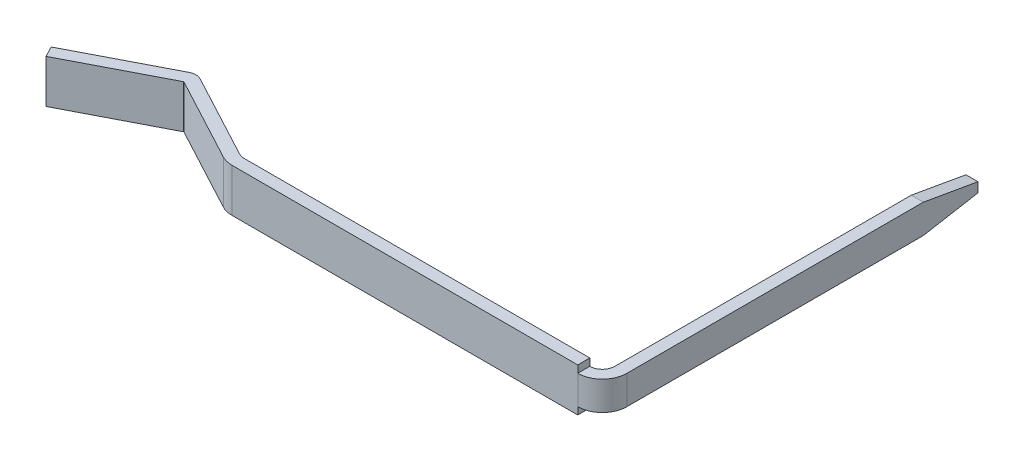
ISO-10303-21;
HEADER;
FILE_DESCRIPTION(('STEP AP214'),'2;1');
FILE_NAME('part.step','',(''),(''),'','','');
FILE_SCHEMA(('AUTOMOTIVE_DESIGN { 1 0 10303 214 1 1 1 1 }'));
ENDSEC;
DATA;
#1=APPLICATION_CONTEXT('core data for automotive mechanical design processes');
#2=APPLICATION_PROTOCOL_DEFINITION('international standard','automotive_design',2000,#1);
#3=PRODUCT_CONTEXT('',#1,'mechanical');
#4=PRODUCT('Part','Part','',(#3));
#5=PRODUCT_RELATED_PRODUCT_CATEGORY('part','',(#4));
#6=PRODUCT_DEFINITION_FORMATION('','',#4);
#7=PRODUCT_DEFINITION_CONTEXT('part definition',#1,'design');
#8=PRODUCT_DEFINITION('design','',#6,#7);
#9=PRODUCT_DEFINITION_SHAPE('','',#8);
#10=(LENGTH_UNIT() NAMED_UNIT(*) SI_UNIT(.MILLI.,.METRE.));
#11=(NAMED_UNIT(*) PLANE_ANGLE_UNIT() SI_UNIT($,.RADIAN.));
#12=(NAMED_UNIT(*) SI_UNIT($,.STERADIAN.) SOLID_ANGLE_UNIT());
#13=UNCERTAINTY_MEASURE_WITH_UNIT(LENGTH_MEASURE(1.E-05),#10,'distance_accuracy_value','');
#14=(GEOMETRIC_REPRESENTATION_CONTEXT(3) GLOBAL_UNCERTAINTY_ASSIGNED_CONTEXT((#13)) GLOBAL_UNIT_ASSIGNED_CONTEXT((#10,
#11,#12)) REPRESENTATION_CONTEXT('',''));
#15=CARTESIAN_POINT('',(0.,0.,0.));
#16=DIRECTION('',(0.,0.,1.));
#17=DIRECTION('',(1.,0.,0.));
#18=AXIS2_PLACEMENT_3D('',#15,#16,#17);
#19=CARTESIAN_POINT('',(3.845,-0.1,-3.64));
#20=DIRECTION('',(0.,0.,-1.));
#21=DIRECTION('',(0.,1.,0.));
#22=AXIS2_PLACEMENT_3D('',#19,#20,#21);
#23=PLANE('',#22);
#24=DIRECTION('',(0.,-1.,0.));
#25=VECTOR('',#24,1.);
#26=CARTESIAN_POINT('',(3.845,0.,-3.64));
#27=LINE('',#26,#25);
#28=CARTESIAN_POINT('',(3.845,0.100000000000001,-3.64));
#29=VERTEX_POINT('',#28);
#30=CARTESIAN_POINT('',(3.845,-0.100000000000001,-3.64));
#31=VERTEX_POINT('',#30);
#32=EDGE_CURVE('E142',#29,#31,#27,.T.);
#33=ORIENTED_EDGE('',*,*,#32,.F.);
#34=DIRECTION('',(-1.,0.,0.));
#35=VECTOR('',#34,1.);
#36=CARTESIAN_POINT('',(3.97,0.1,-3.64));
#37=LINE('',#36,#35);
#38=CARTESIAN_POINT('',(4.095,0.100000000000001,-3.64));
#39=VERTEX_POINT('',#38);
#40=EDGE_CURVE('E133',#39,#29,#37,.T.);
#41=ORIENTED_EDGE('',*,*,#40,.F.);
#42=DIRECTION('',(0.,1.,0.));
#43=VECTOR('',#42,1.);
#44=CARTESIAN_POINT('',(4.095,0.,-3.64));
#45=LINE('',#44,#43);
#46=CARTESIAN_POINT('',(4.095,-0.100000000000001,-3.64));
#47=VERTEX_POINT('',#46);
#48=EDGE_CURVE('E130',#47,#39,#45,.T.);
#49=ORIENTED_EDGE('',*,*,#48,.F.);
#50=DIRECTION('',(1.,0.,0.));
#51=VECTOR('',#50,1.);
#52=CARTESIAN_POINT('',(3.97,-0.1,-3.64));
#53=LINE('',#52,#51);
#54=EDGE_CURVE('E154',#31,#47,#53,.T.);
#55=ORIENTED_EDGE('',*,*,#54,.F.);
#56=EDGE_LOOP('',(#33,#41,#49,#55));
#57=FACE_BOUND('',#56,.T.);
#58=ADVANCED_FACE('F15',(#57),#23,.T.);
#59=CARTESIAN_POINT('',(4.095,-0.3,-2.50574363607644));
#60=DIRECTION('',(0.,-0.984807753012209,-0.173648177666928));
#61=DIRECTION('',(-1.,0.,0.));
#62=AXIS2_PLACEMENT_3D('',#59,#60,#61);
#63=PLANE('',#62);
#64=DIRECTION('',(0.,0.173648177666932,-0.984807753012208));
#65=VECTOR('',#64,1.);
#66=CARTESIAN_POINT('',(4.095,-0.3,-2.50574363607648));
#67=LINE('',#66,#65);
#68=CARTESIAN_POINT('',(4.095,-0.3,-2.50574363607648));
#69=VERTEX_POINT('',#68);
#70=EDGE_CURVE('E121',#69,#47,#67,.T.);
#71=ORIENTED_EDGE('',*,*,#70,.F.);
#72=DIRECTION('',(1.,0.,0.));
#73=VECTOR('',#72,1.);
#74=CARTESIAN_POINT('',(3.84,-0.3,-2.50574363607648));
#75=LINE('',#74,#73);
#76=CARTESIAN_POINT('',(3.845,-0.3,-2.50574363607644));
#77=VERTEX_POINT('',#76);
#78=EDGE_CURVE('E113',#77,#69,#75,.T.);
#79=ORIENTED_EDGE('',*,*,#78,.F.);
#80=DIRECTION('',(0.,-0.173648177666921,0.98480775301221));
#81=VECTOR('',#80,1.);
#82=CARTESIAN_POINT('',(3.845,-0.100000000000002,-3.64));
#83=LINE('',#82,#81);
#84=EDGE_CURVE('E147',#31,#77,#83,.T.);
#85=ORIENTED_EDGE('',*,*,#84,.F.);
#86=ORIENTED_EDGE('',*,*,#54,.T.);
#87=EDGE_LOOP('',(#71,#79,#85,#86));
#88=FACE_BOUND('',#87,.T.);
#89=ADVANCED_FACE('F234',(#88),#63,.T.);
#90=CARTESIAN_POINT('',(3.585,-0.3,4.18993446181646));
#91=DIRECTION('',(0.,-1.,0.));
#92=DIRECTION('',(0.,0.,-1.));
#93=AXIS2_PLACEMENT_3D('',#90,#91,#92);
#94=PLANE('',#93);
#95=DIRECTION('',(0.,0.,-1.));
#96=VECTOR('',#95,1.);
#97=CARTESIAN_POINT('',(3.585,-0.3,0.84209541286999));
#98=LINE('',#97,#96);
#99=CARTESIAN_POINT('',(3.585,-0.299999999999998,4.15));
#100=VERTEX_POINT('',#99);
#101=CARTESIAN_POINT('',(3.585,-0.299999999999999,3.9));
#102=VERTEX_POINT('',#101);
#103=EDGE_CURVE('E112',#100,#102,#98,.T.);
#104=ORIENTED_EDGE('',*,*,#103,.T.);
#105=CARTESIAN_POINT('',(3.585,-0.3,3.64));
#106=DIRECTION('',(0.,-1.,0.));
#107=DIRECTION('',(1.,0.,0.));
#108=AXIS2_PLACEMENT_3D('',#105,#106,#107);
#109=CIRCLE('',#108,0.26);
#110=CARTESIAN_POINT('',(3.845,-0.3,3.64));
#111=VERTEX_POINT('',#110);
#112=EDGE_CURVE('E122',#102,#111,#109,.F.);
#113=ORIENTED_EDGE('',*,*,#112,.T.);
#114=DIRECTION('',(0.,0.,1.));
#115=VECTOR('',#114,1.);
#116=CARTESIAN_POINT('',(3.845,-0.3,0.));
#117=LINE('',#116,#115);
#118=EDGE_CURVE('E148',#77,#111,#117,.T.);
#119=ORIENTED_EDGE('',*,*,#118,.F.);
#120=ORIENTED_EDGE('',*,*,#78,.T.);
#121=DIRECTION('',(0.,0.,-1.));
#122=VECTOR('',#121,1.);
#123=CARTESIAN_POINT('',(4.095,-0.3,0.));
#124=LINE('',#123,#122);
#125=CARTESIAN_POINT('',(4.095,-0.3,3.64));
#126=VERTEX_POINT('',#125);
#127=EDGE_CURVE('E115',#126,#69,#124,.T.);
#128=ORIENTED_EDGE('',*,*,#127,.F.);
#129=CARTESIAN_POINT('',(3.585,-0.3,3.64));
#130=DIRECTION('',(0.,-1.,0.));
#131=DIRECTION('',(0.,0.,-1.));
#132=AXIS2_PLACEMENT_3D('',#129,#130,#131);
#133=CIRCLE('',#132,0.509999999999999);
#134=EDGE_CURVE('E19',#126,#100,#133,.T.);
#135=ORIENTED_EDGE('',*,*,#134,.T.);
#136=EDGE_LOOP('',(#104,#113,#119,#120,#128,#135));
#137=FACE_BOUND('',#136,.T.);
#138=ADVANCED_FACE('F116',(#137),#94,.T.);
#139=CARTESIAN_POINT('',(4.095,-0.3,3.64));
#140=DIRECTION('',(1.,0.,0.));
#141=DIRECTION('',(0.,0.,-1.));
#142=AXIS2_PLACEMENT_3D('',#139,#140,#141);
#143=PLANE('',#142);
#144=DIRECTION('',(0.,0.,-1.));
#145=VECTOR('',#144,1.);
#146=CARTESIAN_POINT('',(4.095,0.3,0.84209541287));
#147=LINE('',#146,#145);
#148=CARTESIAN_POINT('',(4.095,0.3,3.64));
#149=VERTEX_POINT('',#148);
#150=CARTESIAN_POINT('',(4.095,0.299999999999999,-2.50574363607646));
#151=VERTEX_POINT('',#150);
#152=EDGE_CURVE('E127',#149,#151,#147,.T.);
#153=ORIENTED_EDGE('',*,*,#152,.F.);
#154=DIRECTION('',(0.,-1.,0.));
#155=VECTOR('',#154,1.);
#156=CARTESIAN_POINT('',(4.095,0.,3.64));
#157=LINE('',#156,#155);
#158=EDGE_CURVE('E106',#149,#126,#157,.T.);
#159=ORIENTED_EDGE('',*,*,#158,.T.);
#160=ORIENTED_EDGE('',*,*,#127,.T.);
#161=ORIENTED_EDGE('',*,*,#70,.T.);
#162=ORIENTED_EDGE('',*,*,#48,.T.);
#163=DIRECTION('',(0.,-0.173648177666928,-0.984807753012209));
#164=VECTOR('',#163,1.);
#165=CARTESIAN_POINT('',(4.095,0.2,-3.07287181803822));
#166=LINE('',#165,#164);
#167=EDGE_CURVE('E129',#151,#39,#166,.T.);
#168=ORIENTED_EDGE('',*,*,#167,.F.);
#169=EDGE_LOOP('',(#153,#159,#160,#161,#162,#168));
#170=FACE_BOUND('',#169,.T.);
#171=ADVANCED_FACE('F124',(#170),#143,.T.);
#172=CARTESIAN_POINT('',(4.095,0.1,-3.64));
#173=DIRECTION('',(0.,0.984807753012209,-0.173648177666928));
#174=DIRECTION('',(-1.,0.,0.));
#175=AXIS2_PLACEMENT_3D('',#172,#173,#174);
#176=PLANE('',#175);
#177=ORIENTED_EDGE('',*,*,#167,.T.);
#178=ORIENTED_EDGE('',*,*,#40,.T.);
#179=DIRECTION('',(0.,-0.173648177666921,-0.98480775301221));
#180=VECTOR('',#179,1.);
#181=CARTESIAN_POINT('',(3.845,0.3,-2.50574363607641));
#182=LINE('',#181,#180);
#183=CARTESIAN_POINT('',(3.845,0.3,-2.50574363607643));
#184=VERTEX_POINT('',#183);
#185=EDGE_CURVE('E216',#184,#29,#182,.T.);
#186=ORIENTED_EDGE('',*,*,#185,.F.);
#187=DIRECTION('',(-1.,0.,0.));
#188=VECTOR('',#187,1.);
#189=CARTESIAN_POINT('',(3.84,0.3,-2.50574363607646));
#190=LINE('',#189,#188);
#191=EDGE_CURVE('E243',#151,#184,#190,.T.);
#192=ORIENTED_EDGE('',*,*,#191,.F.);
#193=EDGE_LOOP('',(#177,#178,#186,#192));
#194=FACE_BOUND('',#193,.T.);
#195=ADVANCED_FACE('F241',(#194),#176,.T.);
#196=CARTESIAN_POINT('',(3.845,-0.3,-3.64));
#197=DIRECTION('',(-1.,0.,0.));
#198=DIRECTION('',(0.,0.,1.));
#199=AXIS2_PLACEMENT_3D('',#196,#197,#198);
#200=PLANE('',#199);
#201=DIRECTION('',(0.,0.,1.));
#202=VECTOR('',#201,1.);
#203=CARTESIAN_POINT('',(3.845,0.3,0.84209541287));
#204=LINE('',#203,#202);
#205=CARTESIAN_POINT('',(3.845,0.3,3.64));
#206=VERTEX_POINT('',#205);
#207=EDGE_CURVE('E215',#184,#206,#204,.T.);
#208=ORIENTED_EDGE('',*,*,#207,.F.);
#209=ORIENTED_EDGE('',*,*,#185,.T.);
#210=ORIENTED_EDGE('',*,*,#32,.T.);
#211=ORIENTED_EDGE('',*,*,#84,.T.);
#212=ORIENTED_EDGE('',*,*,#118,.T.);
#213=DIRECTION('',(0.,1.,0.));
#214=VECTOR('',#213,1.);
#215=CARTESIAN_POINT('',(3.845,0.,3.64));
#216=LINE('',#215,#214);
#217=EDGE_CURVE('E151',#111,#206,#216,.T.);
#218=ORIENTED_EDGE('',*,*,#217,.T.);
#219=EDGE_LOOP('',(#208,#209,#210,#211,#212,#218));
#220=FACE_BOUND('',#219,.T.);
#221=ADVANCED_FACE('F231',(#220),#200,.T.);
#222=CARTESIAN_POINT('',(3.585,0.3,-2.50574363607646));
#223=DIRECTION('',(0.,1.,0.));
#224=DIRECTION('',(0.,0.,1.));
#225=AXIS2_PLACEMENT_3D('',#222,#223,#224);
#226=PLANE('',#225);
#227=DIRECTION('',(0.,0.,-1.));
#228=VECTOR('',#227,1.);
#229=CARTESIAN_POINT('',(3.585,0.3,4.025));
#230=LINE('',#229,#228);
#231=CARTESIAN_POINT('',(3.585,0.299999999999999,4.15));
#232=VERTEX_POINT('',#231);
#233=CARTESIAN_POINT('',(3.585,0.299999999999999,3.9));
#234=VERTEX_POINT('',#233);
#235=EDGE_CURVE('E211',#232,#234,#230,.T.);
#236=ORIENTED_EDGE('',*,*,#235,.F.);
#237=CARTESIAN_POINT('',(3.585,0.3,3.64));
#238=DIRECTION('',(0.,-1.,0.));
#239=DIRECTION('',(0.,0.,-1.));
#240=AXIS2_PLACEMENT_3D('',#237,#238,#239);
#241=CIRCLE('',#240,0.509999999999999);
#242=EDGE_CURVE('E209',#149,#232,#241,.T.);
#243=ORIENTED_EDGE('',*,*,#242,.F.);
#244=ORIENTED_EDGE('',*,*,#152,.T.);
#245=ORIENTED_EDGE('',*,*,#191,.T.);
#246=ORIENTED_EDGE('',*,*,#207,.T.);
#247=CARTESIAN_POINT('',(3.585,0.3,3.64));
#248=DIRECTION('',(0.,-1.,0.));
#249=DIRECTION('',(1.,0.,0.));
#250=AXIS2_PLACEMENT_3D('',#247,#248,#249);
#251=CIRCLE('',#250,0.26);
#252=EDGE_CURVE('E212',#234,#206,#251,.F.);
#253=ORIENTED_EDGE('',*,*,#252,.F.);
#254=EDGE_LOOP('',(#236,#243,#244,#245,#246,#253));
#255=FACE_BOUND('',#254,.T.);
#256=ADVANCED_FACE('F247',(#255),#226,.T.);
#257=CARTESIAN_POINT('',(3.585,0.36,3.64));
#258=DIRECTION('',(0.,-1.,0.));
#259=DIRECTION('',(1.,0.,0.));
#260=AXIS2_PLACEMENT_3D('',#257,#258,#259);
#261=CYLINDRICAL_SURFACE('',#260,0.26);
#262=ORIENTED_EDGE('',*,*,#112,.F.);
#263=DIRECTION('',(0.,-1.,0.));
#264=VECTOR('',#263,1.);
#265=CARTESIAN_POINT('',(3.585,0.,3.9));
#266=LINE('',#265,#264);
#267=EDGE_CURVE('E255',#234,#102,#266,.T.);
#268=ORIENTED_EDGE('',*,*,#267,.F.);
#269=ORIENTED_EDGE('',*,*,#252,.T.);
#270=ORIENTED_EDGE('',*,*,#217,.F.);
#271=EDGE_LOOP('',(#262,#268,#269,#270));
#272=FACE_BOUND('',#271,.T.);
#273=ADVANCED_FACE('F226',(#272),#261,.F.);
#274=CARTESIAN_POINT('',(3.585,0.36,3.64));
#275=DIRECTION('',(0.,-1.,0.));
#276=DIRECTION('',(0.,0.,-1.));
#277=AXIS2_PLACEMENT_3D('',#274,#275,#276);
#278=CYLINDRICAL_SURFACE('',#277,0.509999999999999);
#279=DIRECTION('',(0.,1.,0.));
#280=VECTOR('',#279,1.);
#281=CARTESIAN_POINT('',(3.585,0.,4.15));
#282=LINE('',#281,#280);
#283=EDGE_CURVE('E109',#100,#232,#282,.T.);
#284=ORIENTED_EDGE('',*,*,#283,.F.);
#285=ORIENTED_EDGE('',*,*,#134,.F.);
#286=ORIENTED_EDGE('',*,*,#158,.F.);
#287=ORIENTED_EDGE('',*,*,#242,.T.);
#288=EDGE_LOOP('',(#284,#285,#286,#287));
#289=FACE_BOUND('',#288,.T.);
#290=ADVANCED_FACE('F103',(#289),#278,.T.);
#291=CARTESIAN_POINT('',(3.585,-0.45,4.15));
#292=DIRECTION('',(1.,0.,0.));
#293=DIRECTION('',(0.,0.,-1.));
#294=AXIS2_PLACEMENT_3D('',#291,#292,#293);
#295=PLANE('',#294);
#296=DIRECTION('',(0.,1.,0.));
#297=VECTOR('',#296,1.);
#298=CARTESIAN_POINT('',(3.585,0.,4.15));
#299=LINE('',#298,#297);
#300=CARTESIAN_POINT('',(3.585,-0.45,4.15));
#301=VERTEX_POINT('',#300);
#302=EDGE_CURVE('E261',#301,#100,#299,.T.);
#303=ORIENTED_EDGE('',*,*,#302,.F.);
#304=DIRECTION('',(0.,0.,1.));
#305=VECTOR('',#304,1.);
#306=CARTESIAN_POINT('',(3.585,-0.45,3.52124660035362));
#307=LINE('',#306,#305);
#308=CARTESIAN_POINT('',(3.585,-0.45,3.9));
#309=VERTEX_POINT('',#308);
#310=EDGE_CURVE('E271',#309,#301,#307,.T.);
#311=ORIENTED_EDGE('',*,*,#310,.F.);
#312=DIRECTION('',(0.,-1.,0.));
#313=VECTOR('',#312,1.);
#314=CARTESIAN_POINT('',(3.585,0.,3.9));
#315=LINE('',#314,#313);
#316=EDGE_CURVE('E257',#102,#309,#315,.T.);
#317=ORIENTED_EDGE('',*,*,#316,.F.);
#318=ORIENTED_EDGE('',*,*,#103,.F.);
#319=EDGE_LOOP('',(#303,#311,#317,#318));
#320=FACE_BOUND('',#319,.T.);
#321=ADVANCED_FACE('F409',(#320),#295,.T.);
#322=CARTESIAN_POINT('',(3.585,0.3,4.15));
#323=DIRECTION('',(1.,0.,0.));
#324=DIRECTION('',(0.,0.,-1.));
#325=AXIS2_PLACEMENT_3D('',#322,#323,#324);
#326=PLANE('',#325);
#327=ORIENTED_EDGE('',*,*,#235,.T.);
#328=DIRECTION('',(0.,-1.,0.));
#329=VECTOR('',#328,1.);
#330=CARTESIAN_POINT('',(3.585,0.,3.9));
#331=LINE('',#330,#329);
#332=CARTESIAN_POINT('',(3.585,0.45,3.90000000000001));
#333=VERTEX_POINT('',#332);
#334=EDGE_CURVE('E258',#333,#234,#331,.T.);
#335=ORIENTED_EDGE('',*,*,#334,.F.);
#336=DIRECTION('',(-1.17961196366441E-13,0.,-1.));
#337=VECTOR('',#336,1.);
#338=CARTESIAN_POINT('',(3.58500000000003,0.45,4.14999999999998));
#339=LINE('',#338,#337);
#340=CARTESIAN_POINT('',(3.58500000000002,0.45,4.14999999999999));
#341=VERTEX_POINT('',#340);
#342=EDGE_CURVE('E186',#341,#333,#339,.T.);
#343=ORIENTED_EDGE('',*,*,#342,.F.);
#344=DIRECTION('',(0.,1.,0.));
#345=VECTOR('',#344,1.);
#346=CARTESIAN_POINT('',(3.585,0.,4.15));
#347=LINE('',#346,#345);
#348=EDGE_CURVE('E260',#232,#341,#347,.T.);
#349=ORIENTED_EDGE('',*,*,#348,.F.);
#350=EDGE_LOOP('',(#327,#335,#343,#349));
#351=FACE_BOUND('',#350,.T.);
#352=ADVANCED_FACE('F423',(#351),#326,.T.);
#353=CARTESIAN_POINT('',(3.585,-0.45,3.9));
#354=DIRECTION('',(0.,0.,-1.));
#355=DIRECTION('',(-1.,0.,0.));
#356=AXIS2_PLACEMENT_3D('',#353,#354,#355);
#357=PLANE('',#356);
#358=ORIENTED_EDGE('',*,*,#267,.T.);
#359=ORIENTED_EDGE('',*,*,#316,.T.);
#360=DIRECTION('',(1.,0.,0.));
#361=VECTOR('',#360,1.);
#362=CARTESIAN_POINT('',(-2.03351,-0.45,3.9));
#363=LINE('',#362,#361);
#364=CARTESIAN_POINT('',(-3.585,-0.45,3.9));
#365=VERTEX_POINT('',#364);
#366=EDGE_CURVE('E274',#365,#309,#363,.T.);
#367=ORIENTED_EDGE('',*,*,#366,.F.);
#368=DIRECTION('',(0.,-1.,0.));
#369=VECTOR('',#368,1.);
#370=CARTESIAN_POINT('',(-3.585,0.,3.9));
#371=LINE('',#370,#369);
#372=CARTESIAN_POINT('',(-3.585,0.45,3.90000000000001));
#373=VERTEX_POINT('',#372);
#374=EDGE_CURVE('E268',#373,#365,#371,.T.);
#375=ORIENTED_EDGE('',*,*,#374,.F.);
#376=DIRECTION('',(-1.,0.,0.));
#377=VECTOR('',#376,1.);
#378=CARTESIAN_POINT('',(3.585,0.45,3.90000000000002));
#379=LINE('',#378,#377);
#380=EDGE_CURVE('E183',#333,#373,#379,.T.);
#381=ORIENTED_EDGE('',*,*,#380,.F.);
#382=ORIENTED_EDGE('',*,*,#334,.T.);
#383=EDGE_LOOP('',(#358,#359,#367,#375,#381,#382));
#384=FACE_BOUND('',#383,.T.);
#385=ADVANCED_FACE('F405',(#384),#357,.T.);
#386=CARTESIAN_POINT('',(-3.585,0.54,3.63999999999992));
#387=DIRECTION('',(0.,-1.,0.));
#388=DIRECTION('',(0.,0.,-1.));
#389=AXIS2_PLACEMENT_3D('',#386,#387,#388);
#390=CYLINDRICAL_SURFACE('',#389,0.260000000000076);
#391=CARTESIAN_POINT('',(-3.585,0.45,3.63999999999992));
#392=DIRECTION('',(0.,-1.,0.));
#393=DIRECTION('',(0.,0.,-1.));
#394=AXIS2_PLACEMENT_3D('',#391,#392,#393);
#395=CIRCLE('',#394,0.260000000000076);
#396=CARTESIAN_POINT('',(-3.70761125591285,0.45,3.86927380993799));
#397=VERTEX_POINT('',#396);
#398=EDGE_CURVE('E180',#373,#397,#395,.T.);
#399=ORIENTED_EDGE('',*,*,#398,.F.);
#400=ORIENTED_EDGE('',*,*,#374,.T.);
#401=CARTESIAN_POINT('',(-3.585,-0.45,3.63999999999992));
#402=DIRECTION('',(0.,-1.,0.));
#403=DIRECTION('',(0.,0.,-1.));
#404=AXIS2_PLACEMENT_3D('',#401,#402,#403);
#405=CIRCLE('',#404,0.260000000000076);
#406=CARTESIAN_POINT('',(-3.70761125591284,-0.45,3.86927380993798));
#407=VERTEX_POINT('',#406);
#408=EDGE_CURVE('E190',#407,#365,#405,.F.);
#409=ORIENTED_EDGE('',*,*,#408,.F.);
#410=DIRECTION('',(0.,-1.,0.));
#411=VECTOR('',#410,1.);
#412=CARTESIAN_POINT('',(-3.70761125591282,0.,3.86927380993798));
#413=LINE('',#412,#411);
#414=EDGE_CURVE('E287',#397,#407,#413,.T.);
#415=ORIENTED_EDGE('',*,*,#414,.F.);
#416=EDGE_LOOP('',(#399,#400,#409,#415));
#417=FACE_BOUND('',#416,.T.);
#418=ADVANCED_FACE('F402',(#417),#390,.F.);
#419=CARTESIAN_POINT('',(-3.70761125591282,-0.45,3.86927380993798));
#420=DIRECTION('',(0.471581753510862,0.,-0.881822345915332));
#421=DIRECTION('',(-0.881822345915332,0.,-0.471581753510862));
#422=AXIS2_PLACEMENT_3D('',#419,#420,#421);
#423=PLANE('',#422);
#424=DIRECTION('',(-0.88182234591532,0.,-0.471581753510886));
#425=VECTOR('',#424,1.);
#426=CARTESIAN_POINT('',(-3.70761125591285,0.45,3.86927380993803));
#427=LINE('',#426,#425);
#428=CARTESIAN_POINT('',(-5.4626372249179,0.45,2.9307194313217));
#429=VERTEX_POINT('',#428);
#430=EDGE_CURVE('E176',#397,#429,#427,.T.);
#431=ORIENTED_EDGE('',*,*,#430,.F.);
#432=ORIENTED_EDGE('',*,*,#414,.T.);
#433=DIRECTION('',(0.881822345915332,0.,0.471581753510862));
#434=VECTOR('',#433,1.);
#435=CARTESIAN_POINT('',(-5.46263722491794,-0.45,2.9307194313217));
#436=LINE('',#435,#434);
#437=CARTESIAN_POINT('',(-5.46263722491791,-0.45,2.93071943132171));
#438=VERTEX_POINT('',#437);
#439=EDGE_CURVE('E194',#438,#407,#436,.T.);
#440=ORIENTED_EDGE('',*,*,#439,.F.);
#441=DIRECTION('',(0.,1.,0.));
#442=VECTOR('',#441,1.);
#443=CARTESIAN_POINT('',(-5.4626372249179,0.,2.9307194313217));
#444=LINE('',#443,#442);
#445=EDGE_CURVE('E284',#438,#429,#444,.T.);
#446=ORIENTED_EDGE('',*,*,#445,.T.);
#447=EDGE_LOOP('',(#431,#432,#440,#446));
#448=FACE_BOUND('',#447,.T.);
#449=ADVANCED_FACE('F352',(#448),#423,.T.);
#450=CARTESIAN_POINT('',(-7.47029587643393,-0.45,4.12213276218726));
#451=DIRECTION('',(0.458816494264272,0.,0.888531048749025));
#452=DIRECTION('',(0.888531048749025,0.,-0.458816494264272));
#453=AXIS2_PLACEMENT_3D('',#450,#451,#452);
#454=PLANE('',#453);
#455=DIRECTION('',(0.888531048749026,0.,-0.458816494264271));
#456=VECTOR('',#455,1.);
#457=CARTESIAN_POINT('',(-3.03455288649492,0.45,1.83161961583573));
#458=LINE('',#457,#456);
#459=CARTESIAN_POINT('',(-7.47029587643394,0.45,4.12213276218724));
#460=VERTEX_POINT('',#459);
#461=CARTESIAN_POINT('',(-5.58983664577338,0.45,3.15110793077219));
#462=VERTEX_POINT('',#461);
#463=EDGE_CURVE('E175',#460,#462,#458,.T.);
#464=ORIENTED_EDGE('',*,*,#463,.F.);
#465=DIRECTION('',(0.,1.,0.));
#466=VECTOR('',#465,1.);
#467=CARTESIAN_POINT('',(-7.47029587643393,0.,4.12213276218726));
#468=LINE('',#467,#466);
#469=CARTESIAN_POINT('',(-7.47029587643393,-0.45,4.12213276218726));
#470=VERTEX_POINT('',#469);
#471=EDGE_CURVE('E189',#470,#460,#468,.T.);
#472=ORIENTED_EDGE('',*,*,#471,.F.);
#473=DIRECTION('',(-0.888531048749027,0.,0.458816494264269));
#474=VECTOR('',#473,1.);
#475=CARTESIAN_POINT('',(-5.58983664577335,-0.45,3.1511079307722));
#476=LINE('',#475,#474);
#477=CARTESIAN_POINT('',(-5.58983664577337,-0.45,3.1511079307722));
#478=VERTEX_POINT('',#477);
#479=EDGE_CURVE('E197',#478,#470,#476,.T.);
#480=ORIENTED_EDGE('',*,*,#479,.F.);
#481=DIRECTION('',(0.,-1.,0.));
#482=VECTOR('',#481,1.);
#483=CARTESIAN_POINT('',(-5.58983664577337,0.,3.1511079307722));
#484=LINE('',#483,#482);
#485=EDGE_CURVE('E290',#462,#478,#484,.T.);
#486=ORIENTED_EDGE('',*,*,#485,.F.);
#487=EDGE_LOOP('',(#464,#472,#480,#486));
#488=FACE_BOUND('',#487,.T.);
#489=ADVANCED_FACE('F397',(#488),#454,.T.);
#490=CARTESIAN_POINT('',(-5.58524848083072,0.54,3.15999324125973));
#491=DIRECTION('',(0.,-1.,0.));
#492=DIRECTION('',(0.,0.,-1.));
#493=AXIS2_PLACEMENT_3D('',#490,#491,#492);
#494=CYLINDRICAL_SURFACE('',#493,0.0100000000000339);
#495=CARTESIAN_POINT('',(-5.58524848083072,-0.45,3.15999324125971));
#496=DIRECTION('',(0.,-1.,0.));
#497=DIRECTION('',(0.,0.,-1.));
#498=AXIS2_PLACEMENT_3D('',#495,#496,#497);
#499=CIRCLE('',#498,0.0100000000000211);
#500=CARTESIAN_POINT('',(-5.5805326632956,-0.45,3.15117501780053));
#501=VERTEX_POINT('',#500);
#502=EDGE_CURVE('E199',#501,#478,#499,.F.);
#503=ORIENTED_EDGE('',*,*,#502,.F.);
#504=DIRECTION('',(0.,-1.,0.));
#505=VECTOR('',#504,1.);
#506=CARTESIAN_POINT('',(-5.58053266329562,0.,3.15117501780053));
#507=LINE('',#506,#505);
#508=CARTESIAN_POINT('',(-5.5805326632956,0.45,3.15117501780052));
#509=VERTEX_POINT('',#508);
#510=EDGE_CURVE('E296',#509,#501,#507,.T.);
#511=ORIENTED_EDGE('',*,*,#510,.F.);
#512=CARTESIAN_POINT('',(-5.58524848083072,0.45,3.15999324125973));
#513=DIRECTION('',(0.,1.,0.));
#514=DIRECTION('',(0.,0.,1.));
#515=AXIS2_PLACEMENT_3D('',#512,#513,#514);
#516=CIRCLE('',#515,0.0100000000000339);
#517=EDGE_CURVE('E172',#462,#509,#516,.F.);
#518=ORIENTED_EDGE('',*,*,#517,.F.);
#519=ORIENTED_EDGE('',*,*,#485,.T.);
#520=EDGE_LOOP('',(#503,#511,#518,#519));
#521=FACE_BOUND('',#520,.T.);
#522=ADVANCED_FACE('F392',(#521),#494,.F.);
#523=CARTESIAN_POINT('',(-5.58053266329562,-0.45,3.15117501780053));
#524=DIRECTION('',(-0.471581753510866,0.,0.88182234591533));
#525=DIRECTION('',(0.88182234591533,0.,0.471581753510866));
#526=AXIS2_PLACEMENT_3D('',#523,#524,#525);
#527=PLANE('',#526);
#528=DIRECTION('',(0.881822345915319,0.,0.471581753510888));
#529=VECTOR('',#528,1.);
#530=CARTESIAN_POINT('',(-5.5805326632956,0.45,3.15117501780051));
#531=LINE('',#530,#529);
#532=CARTESIAN_POINT('',(-3.82550669429056,0.45,4.08972939641682));
#533=VERTEX_POINT('',#532);
#534=EDGE_CURVE('E169',#509,#533,#531,.T.);
#535=ORIENTED_EDGE('',*,*,#534,.F.);
#536=ORIENTED_EDGE('',*,*,#510,.T.);
#537=DIRECTION('',(-0.88182234591532,0.,-0.471581753510886));
#538=VECTOR('',#537,1.);
#539=CARTESIAN_POINT('',(-3.82550669429059,-0.45,4.08972939641682));
#540=LINE('',#539,#538);
#541=CARTESIAN_POINT('',(-3.82550669429057,-0.45,4.08972939641682));
#542=VERTEX_POINT('',#541);
#543=EDGE_CURVE('E202',#542,#501,#540,.T.);
#544=ORIENTED_EDGE('',*,*,#543,.F.);
#545=DIRECTION('',(0.,-1.,0.));
#546=VECTOR('',#545,1.);
#547=CARTESIAN_POINT('',(-3.82550669429054,0.,4.08972939641682));
#548=LINE('',#547,#546);
#549=EDGE_CURVE('E279',#533,#542,#548,.T.);
#550=ORIENTED_EDGE('',*,*,#549,.F.);
#551=EDGE_LOOP('',(#535,#536,#544,#550));
#552=FACE_BOUND('',#551,.T.);
#553=ADVANCED_FACE('F420',(#552),#527,.T.);
#554=CARTESIAN_POINT('',(-3.585,0.54,3.63999999999993));
#555=DIRECTION('',(0.,-1.,0.));
#556=DIRECTION('',(0.,0.,-1.));
#557=AXIS2_PLACEMENT_3D('',#554,#555,#556);
#558=CYLINDRICAL_SURFACE('',#557,0.510000000000064);
#559=CARTESIAN_POINT('',(-3.585,0.45,3.63999999999993));
#560=DIRECTION('',(0.,1.,0.));
#561=DIRECTION('',(0.,0.,1.));
#562=AXIS2_PLACEMENT_3D('',#559,#560,#561);
#563=CIRCLE('',#562,0.510000000000064);
#564=CARTESIAN_POINT('',(-3.585,0.45,4.14999999999999));
#565=VERTEX_POINT('',#564);
#566=EDGE_CURVE('E166',#533,#565,#563,.T.);
#567=ORIENTED_EDGE('',*,*,#566,.F.);
#568=ORIENTED_EDGE('',*,*,#549,.T.);
#569=CARTESIAN_POINT('',(-3.585,-0.45,3.63999999999993));
#570=DIRECTION('',(0.,-1.,0.));
#571=DIRECTION('',(0.,0.,-1.));
#572=AXIS2_PLACEMENT_3D('',#569,#570,#571);
#573=CIRCLE('',#572,0.510000000000064);
#574=CARTESIAN_POINT('',(-3.585,-0.45,4.15));
#575=VERTEX_POINT('',#574);
#576=EDGE_CURVE('E205',#575,#542,#573,.T.);
#577=ORIENTED_EDGE('',*,*,#576,.F.);
#578=DIRECTION('',(0.,-1.,0.));
#579=VECTOR('',#578,1.);
#580=CARTESIAN_POINT('',(-3.585,0.,4.15));
#581=LINE('',#580,#579);
#582=EDGE_CURVE('E306',#565,#575,#581,.T.);
#583=ORIENTED_EDGE('',*,*,#582,.F.);
#584=EDGE_LOOP('',(#567,#568,#577,#583));
#585=FACE_BOUND('',#584,.T.);
#586=ADVANCED_FACE('F417',(#585),#558,.T.);
#587=CARTESIAN_POINT('',(-3.585,-0.45,4.15));
#588=DIRECTION('',(0.,0.,1.));
#589=DIRECTION('',(1.,0.,0.));
#590=AXIS2_PLACEMENT_3D('',#587,#588,#589);
#591=PLANE('',#590);
#592=DIRECTION('',(1.,0.,0.));
#593=VECTOR('',#592,1.);
#594=CARTESIAN_POINT('',(-3.585,0.45,4.14999999999998));
#595=LINE('',#594,#593);
#596=EDGE_CURVE('E163',#565,#341,#595,.T.);
#597=ORIENTED_EDGE('',*,*,#596,.F.);
#598=ORIENTED_EDGE('',*,*,#582,.T.);
#599=DIRECTION('',(-1.,0.,0.));
#600=VECTOR('',#599,1.);
#601=CARTESIAN_POINT('',(-2.03351,-0.45,4.15));
#602=LINE('',#601,#600);
#603=EDGE_CURVE('E208',#301,#575,#602,.T.);
#604=ORIENTED_EDGE('',*,*,#603,.F.);
#605=ORIENTED_EDGE('',*,*,#302,.T.);
#606=ORIENTED_EDGE('',*,*,#283,.T.);
#607=ORIENTED_EDGE('',*,*,#348,.T.);
#608=EDGE_LOOP('',(#597,#598,#604,#605,#606,#607));
#609=FACE_BOUND('',#608,.T.);
#610=ADVANCED_FACE('F414',(#609),#591,.T.);
#611=CARTESIAN_POINT('',(-7.65202,-0.45,4.15));
#612=DIRECTION('',(0.,-1.,0.));
#613=DIRECTION('',(0.,0.,-1.));
#614=AXIS2_PLACEMENT_3D('',#611,#612,#613);
#615=PLANE('',#614);
#616=ORIENTED_EDGE('',*,*,#439,.T.);
#617=ORIENTED_EDGE('',*,*,#408,.T.);
#618=ORIENTED_EDGE('',*,*,#366,.T.);
#619=ORIENTED_EDGE('',*,*,#310,.T.);
#620=ORIENTED_EDGE('',*,*,#603,.T.);
#621=ORIENTED_EDGE('',*,*,#576,.T.);
#622=ORIENTED_EDGE('',*,*,#543,.T.);
#623=ORIENTED_EDGE('',*,*,#502,.T.);
#624=ORIENTED_EDGE('',*,*,#479,.T.);
#625=DIRECTION('',(0.458816494264273,0.,0.888531048749025));
#626=VECTOR('',#625,1.);
#627=CARTESIAN_POINT('',(-7.52764793821696,-0.45,4.01106638109363));
#628=LINE('',#627,#626);
#629=CARTESIAN_POINT('',(-7.585,-0.45,3.9));
#630=VERTEX_POINT('',#629);
#631=EDGE_CURVE('E193',#630,#470,#628,.T.);
#632=ORIENTED_EDGE('',*,*,#631,.F.);
#633=DIRECTION('',(-0.888531048749027,0.,0.45881649426427));
#634=VECTOR('',#633,1.);
#635=CARTESIAN_POINT('',(-6.64477038466971,-0.45,3.41448758429247));
#636=LINE('',#635,#634);
#637=CARTESIAN_POINT('',(-5.70454076933944,-0.45,2.92897516858495));
#638=VERTEX_POINT('',#637);
#639=EDGE_CURVE('E159',#638,#630,#636,.T.);
#640=ORIENTED_EDGE('',*,*,#639,.F.);
#641=CARTESIAN_POINT('',(-5.58524848083072,-0.449999999999997,3.15999324125967));
#642=DIRECTION('',(0.,-1.,0.));
#643=DIRECTION('',(0.,0.,-1.));
#644=AXIS2_PLACEMENT_3D('',#641,#642,#643);
#645=CIRCLE('',#644,0.259999999999968);
#646=EDGE_CURVE('E33',#438,#638,#645,.F.);
#647=ORIENTED_EDGE('',*,*,#646,.F.);
#648=EDGE_LOOP('',(#616,#617,#618,#619,#620,#621,#622,#623,#624,#632,#640,#647));
#649=FACE_BOUND('',#648,.T.);
#650=ADVANCED_FACE('F401',(#649),#615,.T.);
#651=CARTESIAN_POINT('',(-7.585,0.45,3.9));
#652=DIRECTION('',(-0.888531048749025,0.,0.458816494264273));
#653=DIRECTION('',(0.,-1.,0.));
#654=AXIS2_PLACEMENT_3D('',#651,#652,#653);
#655=PLANE('',#654);
#656=ORIENTED_EDGE('',*,*,#631,.T.);
#657=ORIENTED_EDGE('',*,*,#471,.T.);
#658=DIRECTION('',(0.458816494264271,0.,0.888531048749026));
#659=VECTOR('',#658,1.);
#660=CARTESIAN_POINT('',(-6.3509681478094,0.45,6.28979118999384));
#661=LINE('',#660,#659);
#662=CARTESIAN_POINT('',(-7.585,0.45,3.9));
#663=VERTEX_POINT('',#662);
#664=EDGE_CURVE('E179',#663,#460,#661,.T.);
#665=ORIENTED_EDGE('',*,*,#664,.F.);
#666=DIRECTION('',(0.,1.,0.));
#667=VECTOR('',#666,1.);
#668=CARTESIAN_POINT('',(-7.585,0.,3.9));
#669=LINE('',#668,#667);
#670=EDGE_CURVE('E320',#630,#663,#669,.T.);
#671=ORIENTED_EDGE('',*,*,#670,.F.);
#672=EDGE_LOOP('',(#656,#657,#665,#671));
#673=FACE_BOUND('',#672,.T.);
#674=ADVANCED_FACE('F400',(#673),#655,.T.);
#675=CARTESIAN_POINT('',(1.28648597987805,0.45,-0.68102629270302));
#676=DIRECTION('',(0.,1.,0.));
#677=DIRECTION('',(-0.888531048749026,0.,0.458816494264271));
#678=AXIS2_PLACEMENT_3D('',#675,#676,#677);
#679=PLANE('',#678);
#680=ORIENTED_EDGE('',*,*,#566,.T.);
#681=ORIENTED_EDGE('',*,*,#596,.T.);
#682=ORIENTED_EDGE('',*,*,#342,.T.);
#683=ORIENTED_EDGE('',*,*,#380,.T.);
#684=ORIENTED_EDGE('',*,*,#398,.T.);
#685=ORIENTED_EDGE('',*,*,#430,.T.);
#686=CARTESIAN_POINT('',(-5.58524848083072,0.450000000000003,3.15999324125966));
#687=DIRECTION('',(0.,-1.,0.));
#688=DIRECTION('',(0.,0.,-1.));
#689=AXIS2_PLACEMENT_3D('',#686,#687,#688);
#690=CIRCLE('',#689,0.259999999999968);
#691=CARTESIAN_POINT('',(-5.70454076933945,0.45,2.92897516858495));
#692=VERTEX_POINT('',#691);
#693=EDGE_CURVE('E160',#692,#429,#690,.T.);
#694=ORIENTED_EDGE('',*,*,#693,.F.);
#695=DIRECTION('',(0.888531048749027,0.,-0.45881649426427));
#696=VECTOR('',#695,1.);
#697=CARTESIAN_POINT('',(-6.64477038466971,0.45,3.41448758429247));
#698=LINE('',#697,#696);
#699=EDGE_CURVE('E25',#663,#692,#698,.T.);
#700=ORIENTED_EDGE('',*,*,#699,.F.);
#701=ORIENTED_EDGE('',*,*,#664,.T.);
#702=ORIENTED_EDGE('',*,*,#463,.T.);
#703=ORIENTED_EDGE('',*,*,#517,.T.);
#704=ORIENTED_EDGE('',*,*,#534,.T.);
#705=EDGE_LOOP('',(#680,#681,#682,#683,#684,#685,#694,#700,#701,#702,#703,#704));
#706=FACE_BOUND('',#705,.T.);
#707=ADVANCED_FACE('F347',(#706),#679,.T.);
#708=CARTESIAN_POINT('',(-5.70454076933943,-0.45,2.92897516858494));
#709=DIRECTION('',(-0.45881649426427,0.,-0.888531048749026));
#710=DIRECTION('',(-0.888531048749026,0.,0.45881649426427));
#711=AXIS2_PLACEMENT_3D('',#708,#709,#710);
#712=PLANE('',#711);
#713=ORIENTED_EDGE('',*,*,#699,.T.);
#714=DIRECTION('',(0.,1.,0.));
#715=VECTOR('',#714,1.);
#716=CARTESIAN_POINT('',(-5.70454076933943,0.,2.92897516858494));
#717=LINE('',#716,#715);
#718=EDGE_CURVE('E10',#638,#692,#717,.T.);
#719=ORIENTED_EDGE('',*,*,#718,.F.);
#720=ORIENTED_EDGE('',*,*,#639,.T.);
#721=ORIENTED_EDGE('',*,*,#670,.T.);
#722=EDGE_LOOP('',(#713,#719,#720,#721));
#723=FACE_BOUND('',#722,.T.);
#724=ADVANCED_FACE('F339',(#723),#712,.T.);
#725=CARTESIAN_POINT('',(-5.58524848083072,0.539999999999997,3.15999324125976));
#726=DIRECTION('',(0.,-1.,0.));
#727=DIRECTION('',(0.,0.,-1.));
#728=AXIS2_PLACEMENT_3D('',#725,#726,#727);
#729=CYLINDRICAL_SURFACE('',#728,0.260000000000071);
#730=ORIENTED_EDGE('',*,*,#646,.T.);
#731=ORIENTED_EDGE('',*,*,#718,.T.);
#732=ORIENTED_EDGE('',*,*,#693,.T.);
#733=ORIENTED_EDGE('',*,*,#445,.F.);
#734=EDGE_LOOP('',(#730,#731,#732,#733));
#735=FACE_BOUND('',#734,.T.);
#736=ADVANCED_FACE('F17',(#735),#729,.T.);
#737=CLOSED_SHELL('',(#58,#89,#138,#171,#195,#221,#256,#273,#290,#321,#352,#385,#418,#449,#489,
#522,#553,#586,#610,#650,#674,#707,#724,#736));
#738=MANIFOLD_SOLID_BREP('B1',#737);
#739=ADVANCED_BREP_SHAPE_REPRESENTATION('',(#18,#738),#14);
#740=SHAPE_DEFINITION_REPRESENTATION(#9,#739);
ENDSEC;
END-ISO-10303-21;
